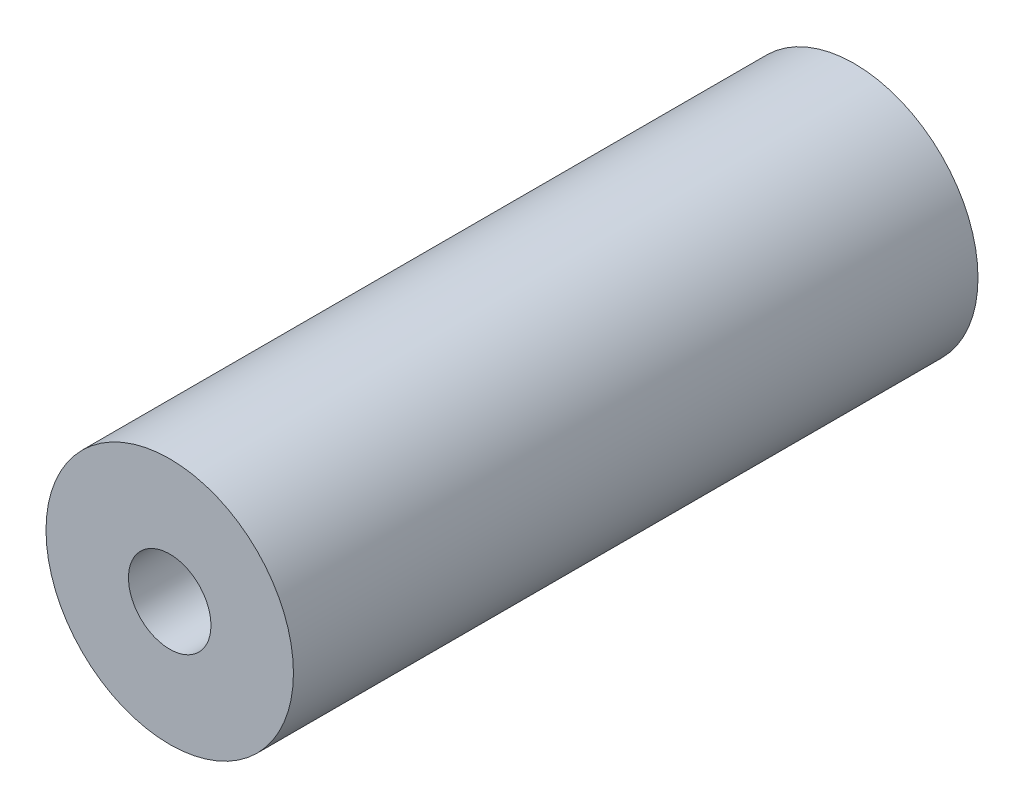
ISO-10303-21;
HEADER;
FILE_DESCRIPTION(('STEP AP214'),'2;1');
FILE_NAME('part.step','',(''),(''),'','','');
FILE_SCHEMA(('AUTOMOTIVE_DESIGN { 1 0 10303 214 1 1 1 1 }'));
ENDSEC;
DATA;
#1=APPLICATION_CONTEXT('core data for automotive mechanical design processes');
#2=APPLICATION_PROTOCOL_DEFINITION('international standard','automotive_design',2000,#1);
#3=PRODUCT_CONTEXT('',#1,'mechanical');
#4=PRODUCT('Part','Part','',(#3));
#5=PRODUCT_RELATED_PRODUCT_CATEGORY('part','',(#4));
#6=PRODUCT_DEFINITION_FORMATION('','',#4);
#7=PRODUCT_DEFINITION_CONTEXT('part definition',#1,'design');
#8=PRODUCT_DEFINITION('design','',#6,#7);
#9=PRODUCT_DEFINITION_SHAPE('','',#8);
#10=(LENGTH_UNIT() NAMED_UNIT(*) SI_UNIT(.MILLI.,.METRE.));
#11=(NAMED_UNIT(*) PLANE_ANGLE_UNIT() SI_UNIT($,.RADIAN.));
#12=(NAMED_UNIT(*) SI_UNIT($,.STERADIAN.) SOLID_ANGLE_UNIT());
#13=UNCERTAINTY_MEASURE_WITH_UNIT(LENGTH_MEASURE(1.E-05),#10,'distance_accuracy_value','');
#14=(GEOMETRIC_REPRESENTATION_CONTEXT(3) GLOBAL_UNCERTAINTY_ASSIGNED_CONTEXT((#13)) GLOBAL_UNIT_ASSIGNED_CONTEXT((#10,
#11,#12)) REPRESENTATION_CONTEXT('',''));
#15=CARTESIAN_POINT('',(0.,0.,0.));
#16=DIRECTION('',(0.,0.,1.));
#17=DIRECTION('',(1.,0.,0.));
#18=AXIS2_PLACEMENT_3D('',#15,#16,#17);
#19=CARTESIAN_POINT('',(0.,0.,41.5));
#20=DIRECTION('',(0.,0.,1.));
#21=DIRECTION('',(1.,0.,0.));
#22=AXIS2_PLACEMENT_3D('',#19,#20,#21);
#23=PLANE('',#22);
#24=CARTESIAN_POINT('',(0.,0.,41.5));
#25=DIRECTION('',(0.,0.,1.));
#26=DIRECTION('',(1.,0.,0.));
#27=AXIS2_PLACEMENT_3D('',#24,#25,#26);
#28=CIRCLE('',#27,7.5);
#29=CARTESIAN_POINT('',(7.5,0.,41.5));
#30=VERTEX_POINT('',#29);
#31=EDGE_CURVE('E10',#30,#30,#28,.T.);
#32=ORIENTED_EDGE('',*,*,#31,.T.);
#33=EDGE_LOOP('',(#32));
#34=FACE_BOUND('',#33,.T.);
#35=CARTESIAN_POINT('',(0.,0.,41.5));
#36=DIRECTION('',(0.,0.,1.));
#37=DIRECTION('',(1.,0.,0.));
#38=AXIS2_PLACEMENT_3D('',#35,#36,#37);
#39=CIRCLE('',#38,2.5);
#40=CARTESIAN_POINT('',(2.5,0.,41.5));
#41=VERTEX_POINT('',#40);
#42=EDGE_CURVE('E45',#41,#41,#39,.T.);
#43=ORIENTED_EDGE('',*,*,#42,.F.);
#44=EDGE_LOOP('',(#43));
#45=FACE_BOUND('',#44,.T.);
#46=ADVANCED_FACE('F34',(#34,#45),#23,.T.);
#47=CARTESIAN_POINT('',(0.,0.,0.));
#48=DIRECTION('',(0.,0.,1.));
#49=DIRECTION('',(1.,0.,0.));
#50=AXIS2_PLACEMENT_3D('',#47,#48,#49);
#51=PLANE('',#50);
#52=CARTESIAN_POINT('',(0.,0.,0.));
#53=DIRECTION('',(0.,0.,1.));
#54=DIRECTION('',(1.,0.,0.));
#55=AXIS2_PLACEMENT_3D('',#52,#53,#54);
#56=CIRCLE('',#55,7.5);
#57=CARTESIAN_POINT('',(7.5,0.,0.));
#58=VERTEX_POINT('',#57);
#59=EDGE_CURVE('E38',#58,#58,#56,.T.);
#60=ORIENTED_EDGE('',*,*,#59,.F.);
#61=EDGE_LOOP('',(#60));
#62=FACE_BOUND('',#61,.T.);
#63=CARTESIAN_POINT('',(0.,0.,0.));
#64=DIRECTION('',(0.,0.,1.));
#65=DIRECTION('',(1.,0.,0.));
#66=AXIS2_PLACEMENT_3D('',#63,#64,#65);
#67=CIRCLE('',#66,2.5);
#68=CARTESIAN_POINT('',(2.5,0.,0.));
#69=VERTEX_POINT('',#68);
#70=EDGE_CURVE('E47',#69,#69,#67,.T.);
#71=ORIENTED_EDGE('',*,*,#70,.T.);
#72=EDGE_LOOP('',(#71));
#73=FACE_BOUND('',#72,.T.);
#74=ADVANCED_FACE('F57',(#62,#73),#51,.F.);
#75=CARTESIAN_POINT('',(0.,0.,41.5));
#76=DIRECTION('',(0.,0.,-1.));
#77=DIRECTION('',(-1.,0.,0.));
#78=AXIS2_PLACEMENT_3D('',#75,#76,#77);
#79=CYLINDRICAL_SURFACE('',#78,7.5);
#80=ORIENTED_EDGE('',*,*,#31,.F.);
#81=EDGE_LOOP('',(#80));
#82=FACE_BOUND('',#81,.T.);
#83=ORIENTED_EDGE('',*,*,#59,.T.);
#84=EDGE_LOOP('',(#83));
#85=FACE_BOUND('',#84,.T.);
#86=ADVANCED_FACE('F36',(#82,#85),#79,.T.);
#87=CARTESIAN_POINT('',(0.,0.,41.5));
#88=DIRECTION('',(0.,0.,-1.));
#89=DIRECTION('',(-1.,0.,0.));
#90=AXIS2_PLACEMENT_3D('',#87,#88,#89);
#91=CYLINDRICAL_SURFACE('',#90,2.5);
#92=ORIENTED_EDGE('',*,*,#42,.T.);
#93=EDGE_LOOP('',(#92));
#94=FACE_BOUND('',#93,.T.);
#95=ORIENTED_EDGE('',*,*,#70,.F.);
#96=EDGE_LOOP('',(#95));
#97=FACE_BOUND('',#96,.T.);
#98=ADVANCED_FACE('F53',(#94,#97),#91,.F.);
#99=CLOSED_SHELL('',(#46,#74,#86,#98));
#100=MANIFOLD_SOLID_BREP('B2',#99);
#101=ADVANCED_BREP_SHAPE_REPRESENTATION('',(#18,#100),#14);
#102=SHAPE_DEFINITION_REPRESENTATION(#9,#101);
ENDSEC;
END-ISO-10303-21;
